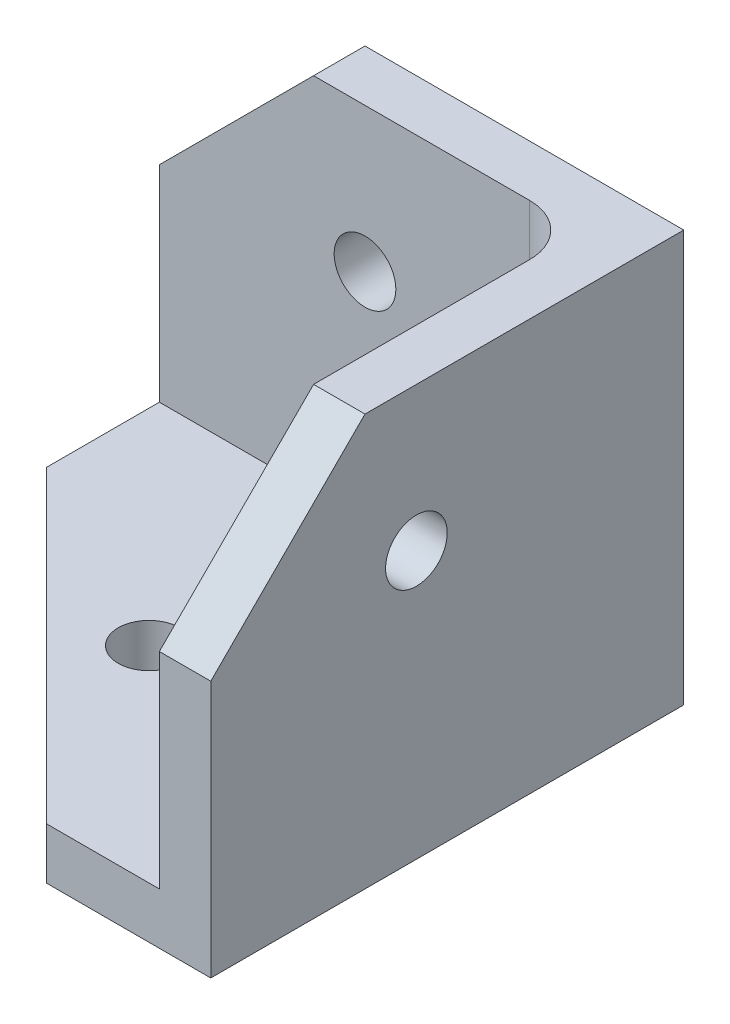
ISO-10303-21;
HEADER;
FILE_DESCRIPTION(('STEP AP214'),'2;1');
FILE_NAME('part.step','',(''),(''),'','','');
FILE_SCHEMA(('AUTOMOTIVE_DESIGN { 1 0 10303 214 1 1 1 1 }'));
ENDSEC;
DATA;
#1=APPLICATION_CONTEXT('core data for automotive mechanical design processes');
#2=APPLICATION_PROTOCOL_DEFINITION('international standard','automotive_design',2000,#1);
#3=PRODUCT_CONTEXT('',#1,'mechanical');
#4=PRODUCT('Part','Part','',(#3));
#5=PRODUCT_RELATED_PRODUCT_CATEGORY('part','',(#4));
#6=PRODUCT_DEFINITION_FORMATION('','',#4);
#7=PRODUCT_DEFINITION_CONTEXT('part definition',#1,'design');
#8=PRODUCT_DEFINITION('design','',#6,#7);
#9=PRODUCT_DEFINITION_SHAPE('','',#8);
#10=(LENGTH_UNIT() NAMED_UNIT(*) SI_UNIT(.MILLI.,.METRE.));
#11=(NAMED_UNIT(*) PLANE_ANGLE_UNIT() SI_UNIT($,.RADIAN.));
#12=(NAMED_UNIT(*) SI_UNIT($,.STERADIAN.) SOLID_ANGLE_UNIT());
#13=UNCERTAINTY_MEASURE_WITH_UNIT(LENGTH_MEASURE(1.E-05),#10,'distance_accuracy_value','');
#14=(GEOMETRIC_REPRESENTATION_CONTEXT(3) GLOBAL_UNCERTAINTY_ASSIGNED_CONTEXT((#13)) GLOBAL_UNIT_ASSIGNED_CONTEXT((#10,
#11,#12)) REPRESENTATION_CONTEXT('',''));
#15=CARTESIAN_POINT('',(0.,0.,0.));
#16=DIRECTION('',(0.,0.,1.));
#17=DIRECTION('',(1.,0.,0.));
#18=AXIS2_PLACEMENT_3D('',#15,#16,#17);
#19=CARTESIAN_POINT('',(-5.,5.,46.));
#20=DIRECTION('',(0.,-1.,0.));
#21=DIRECTION('',(1.,0.,0.));
#22=AXIS2_PLACEMENT_3D('',#19,#20,#21);
#23=PLANE('',#22);
#24=DIRECTION('',(-0.707106781186546,0.,-0.707106781186549));
#25=VECTOR('',#24,1.);
#26=CARTESIAN_POINT('',(-16.,4.99999999999999,46.));
#27=LINE('',#26,#25);
#28=CARTESIAN_POINT('',(-46.,4.99999999999999,15.9999999999999));
#29=VERTEX_POINT('',#28);
#30=CARTESIAN_POINT('',(-16.,5.,46.));
#31=VERTEX_POINT('',#30);
#32=EDGE_CURVE('E136',#29,#31,#27,.F.);
#33=ORIENTED_EDGE('',*,*,#32,.T.);
#34=DIRECTION('',(-1.,0.,0.));
#35=VECTOR('',#34,1.);
#36=CARTESIAN_POINT('',(0.,5.,46.));
#37=LINE('',#36,#35);
#38=CARTESIAN_POINT('',(-5.,5.,46.));
#39=VERTEX_POINT('',#38);
#40=EDGE_CURVE('E146',#31,#39,#37,.F.);
#41=ORIENTED_EDGE('',*,*,#40,.T.);
#42=DIRECTION('',(0.,0.,1.));
#43=VECTOR('',#42,1.);
#44=CARTESIAN_POINT('',(-5.,5.,46.));
#45=LINE('',#44,#43);
#46=CARTESIAN_POINT('',(-5.,5.,9.99999999999999));
#47=VERTEX_POINT('',#46);
#48=EDGE_CURVE('E96',#39,#47,#45,.F.);
#49=ORIENTED_EDGE('',*,*,#48,.T.);
#50=CARTESIAN_POINT('',(-9.99999999999999,5.,9.99999999999999));
#51=DIRECTION('',(0.,-1.,0.));
#52=DIRECTION('',(0.,0.,-1.));
#53=AXIS2_PLACEMENT_3D('',#50,#51,#52);
#54=CIRCLE('',#53,5.);
#55=CARTESIAN_POINT('',(-9.99999999999999,5.,5.));
#56=VERTEX_POINT('',#55);
#57=EDGE_CURVE('E19',#47,#56,#54,.F.);
#58=ORIENTED_EDGE('',*,*,#57,.T.);
#59=DIRECTION('',(1.,0.,0.));
#60=VECTOR('',#59,1.);
#61=CARTESIAN_POINT('',(-46.,5.,5.));
#62=LINE('',#61,#60);
#63=CARTESIAN_POINT('',(-46.,4.99999999999999,5.));
#64=VERTEX_POINT('',#63);
#65=EDGE_CURVE('E102',#64,#56,#62,.T.);
#66=ORIENTED_EDGE('',*,*,#65,.F.);
#67=DIRECTION('',(0.,0.,-1.));
#68=VECTOR('',#67,1.);
#69=CARTESIAN_POINT('',(-46.,4.99999999999999,46.));
#70=LINE('',#69,#68);
#71=EDGE_CURVE('E128',#64,#29,#70,.F.);
#72=ORIENTED_EDGE('',*,*,#71,.T.);
#73=EDGE_LOOP('',(#33,#41,#49,#58,#66,#72));
#74=FACE_BOUND('',#73,.T.);
#75=CARTESIAN_POINT('',(-26.,5.,26.));
#76=DIRECTION('',(0.,1.,0.));
#77=DIRECTION('',(-1.,0.,0.));
#78=AXIS2_PLACEMENT_3D('',#75,#76,#77);
#79=CIRCLE('',#78,3.);
#80=CARTESIAN_POINT('',(-29.,5.,26.));
#81=VERTEX_POINT('',#80);
#82=EDGE_CURVE('E170',#81,#81,#79,.F.);
#83=ORIENTED_EDGE('',*,*,#82,.T.);
#84=EDGE_LOOP('',(#83));
#85=FACE_BOUND('',#84,.T.);
#86=ADVANCED_FACE('F16',(#74,#85),#23,.F.);
#87=CARTESIAN_POINT('',(-5.,40.,46.));
#88=DIRECTION('',(1.,0.,0.));
#89=DIRECTION('',(0.,1.,0.));
#90=AXIS2_PLACEMENT_3D('',#87,#88,#89);
#91=PLANE('',#90);
#92=DIRECTION('',(0.,-1.,0.));
#93=VECTOR('',#92,1.);
#94=CARTESIAN_POINT('',(-5.,40.,9.99999999999999));
#95=LINE('',#94,#93);
#96=CARTESIAN_POINT('',(-5.,40.,9.99999999999999));
#97=VERTEX_POINT('',#96);
#98=EDGE_CURVE('E106',#97,#47,#95,.T.);
#99=ORIENTED_EDGE('',*,*,#98,.T.);
#100=ORIENTED_EDGE('',*,*,#48,.F.);
#101=DIRECTION('',(0.,1.,0.));
#102=VECTOR('',#101,1.);
#103=CARTESIAN_POINT('',(-5.,0.,46.));
#104=LINE('',#103,#102);
#105=CARTESIAN_POINT('',(-5.,25.,46.));
#106=VERTEX_POINT('',#105);
#107=EDGE_CURVE('E133',#39,#106,#104,.T.);
#108=ORIENTED_EDGE('',*,*,#107,.T.);
#109=DIRECTION('',(0.,0.707106781186546,-0.707106781186549));
#110=VECTOR('',#109,1.);
#111=CARTESIAN_POINT('',(-5.,25.,46.));
#112=LINE('',#111,#110);
#113=CARTESIAN_POINT('',(-5.,40.,30.9999999999999));
#114=VERTEX_POINT('',#113);
#115=EDGE_CURVE('E172',#106,#114,#112,.T.);
#116=ORIENTED_EDGE('',*,*,#115,.T.);
#117=DIRECTION('',(0.,0.,-1.));
#118=VECTOR('',#117,1.);
#119=CARTESIAN_POINT('',(-5.,40.,46.));
#120=LINE('',#119,#118);
#121=EDGE_CURVE('E167',#114,#97,#120,.T.);
#122=ORIENTED_EDGE('',*,*,#121,.T.);
#123=EDGE_LOOP('',(#99,#100,#108,#116,#122));
#124=FACE_BOUND('',#123,.T.);
#125=CARTESIAN_POINT('',(-5.,26.,26.));
#126=DIRECTION('',(-1.,0.,0.));
#127=DIRECTION('',(0.,-1.,0.));
#128=AXIS2_PLACEMENT_3D('',#125,#126,#127);
#129=CIRCLE('',#128,3.);
#130=CARTESIAN_POINT('',(-5.,23.,26.));
#131=VERTEX_POINT('',#130);
#132=EDGE_CURVE('E114',#131,#131,#129,.F.);
#133=ORIENTED_EDGE('',*,*,#132,.T.);
#134=EDGE_LOOP('',(#133));
#135=FACE_BOUND('',#134,.T.);
#136=ADVANCED_FACE('F211',(#124,#135),#91,.F.);
#137=CARTESIAN_POINT('',(-10.,40.,9.99999999999999));
#138=DIRECTION('',(0.,-1.,0.));
#139=DIRECTION('',(0.,0.,-1.));
#140=AXIS2_PLACEMENT_3D('',#137,#138,#139);
#141=CYLINDRICAL_SURFACE('',#140,5.);
#142=DIRECTION('',(0.,-1.,0.));
#143=VECTOR('',#142,1.);
#144=CARTESIAN_POINT('',(-9.99999999999999,40.,5.));
#145=LINE('',#144,#143);
#146=CARTESIAN_POINT('',(-10.,40.,5.));
#147=VERTEX_POINT('',#146);
#148=EDGE_CURVE('E108',#56,#147,#145,.F.);
#149=ORIENTED_EDGE('',*,*,#148,.F.);
#150=ORIENTED_EDGE('',*,*,#57,.F.);
#151=ORIENTED_EDGE('',*,*,#98,.F.);
#152=CARTESIAN_POINT('',(-10.,40.,9.99999999999999));
#153=DIRECTION('',(0.,-1.,0.));
#154=DIRECTION('',(0.,0.,-1.));
#155=AXIS2_PLACEMENT_3D('',#152,#153,#154);
#156=CIRCLE('',#155,5.);
#157=EDGE_CURVE('E111',#97,#147,#156,.F.);
#158=ORIENTED_EDGE('',*,*,#157,.T.);
#159=EDGE_LOOP('',(#149,#150,#151,#158));
#160=FACE_BOUND('',#159,.T.);
#161=ADVANCED_FACE('F109',(#160),#141,.F.);
#162=CARTESIAN_POINT('',(-46.,40.,5.));
#163=DIRECTION('',(0.,0.,1.));
#164=DIRECTION('',(0.,-1.,0.));
#165=AXIS2_PLACEMENT_3D('',#162,#163,#164);
#166=PLANE('',#165);
#167=DIRECTION('',(0.707106781186546,0.707106781186549,0.));
#168=VECTOR('',#167,1.);
#169=CARTESIAN_POINT('',(-31.,40.,4.99999999999998));
#170=LINE('',#169,#168);
#171=CARTESIAN_POINT('',(-31.,40.,4.99999999999999));
#172=VERTEX_POINT('',#171);
#173=CARTESIAN_POINT('',(-46.,25.,4.99999999999998));
#174=VERTEX_POINT('',#173);
#175=EDGE_CURVE('E197',#172,#174,#170,.F.);
#176=ORIENTED_EDGE('',*,*,#175,.T.);
#177=DIRECTION('',(0.,1.,0.));
#178=VECTOR('',#177,1.);
#179=CARTESIAN_POINT('',(-46.,4.99999999999999,5.));
#180=LINE('',#179,#178);
#181=EDGE_CURVE('E119',#174,#64,#180,.F.);
#182=ORIENTED_EDGE('',*,*,#181,.T.);
#183=ORIENTED_EDGE('',*,*,#65,.T.);
#184=ORIENTED_EDGE('',*,*,#148,.T.);
#185=DIRECTION('',(1.,0.,0.));
#186=VECTOR('',#185,1.);
#187=CARTESIAN_POINT('',(-5.,40.,5.));
#188=LINE('',#187,#186);
#189=EDGE_CURVE('E166',#147,#172,#188,.F.);
#190=ORIENTED_EDGE('',*,*,#189,.T.);
#191=EDGE_LOOP('',(#176,#182,#183,#184,#190));
#192=FACE_BOUND('',#191,.T.);
#193=CARTESIAN_POINT('',(-26.,26.,5.));
#194=DIRECTION('',(0.,0.,1.));
#195=DIRECTION('',(1.,0.,0.));
#196=AXIS2_PLACEMENT_3D('',#193,#194,#195);
#197=CIRCLE('',#196,3.);
#198=CARTESIAN_POINT('',(-23.,26.,5.));
#199=VERTEX_POINT('',#198);
#200=EDGE_CURVE('E148',#199,#199,#197,.F.);
#201=ORIENTED_EDGE('',*,*,#200,.T.);
#202=EDGE_LOOP('',(#201));
#203=FACE_BOUND('',#202,.T.);
#204=ADVANCED_FACE('F116',(#192,#203),#166,.T.);
#205=CARTESIAN_POINT('',(0.0010000000000036,26.,26.));
#206=DIRECTION('',(-1.,0.,0.));
#207=DIRECTION('',(0.,-1.,0.));
#208=AXIS2_PLACEMENT_3D('',#205,#206,#207);
#209=CYLINDRICAL_SURFACE('',#208,3.);
#210=ORIENTED_EDGE('',*,*,#132,.F.);
#211=EDGE_LOOP('',(#210));
#212=FACE_BOUND('',#211,.T.);
#213=CARTESIAN_POINT('',(0.,26.,26.));
#214=DIRECTION('',(-1.,0.,0.));
#215=DIRECTION('',(0.,-1.,0.));
#216=AXIS2_PLACEMENT_3D('',#213,#214,#215);
#217=CIRCLE('',#216,3.);
#218=CARTESIAN_POINT('',(0.,23.,26.));
#219=VERTEX_POINT('',#218);
#220=EDGE_CURVE('E160',#219,#219,#217,.F.);
#221=ORIENTED_EDGE('',*,*,#220,.T.);
#222=EDGE_LOOP('',(#221));
#223=FACE_BOUND('',#222,.T.);
#224=ADVANCED_FACE('F286',(#212,#223),#209,.F.);
#225=CARTESIAN_POINT('',(0.,25.,46.));
#226=DIRECTION('',(0.,-0.707106781186549,-0.707106781186546));
#227=DIRECTION('',(0.,0.707106781186546,-0.707106781186549));
#228=AXIS2_PLACEMENT_3D('',#225,#226,#227);
#229=PLANE('',#228);
#230=DIRECTION('',(1.,0.,0.));
#231=VECTOR('',#230,1.);
#232=CARTESIAN_POINT('',(-5.,40.,30.9999999999999));
#233=LINE('',#232,#231);
#234=CARTESIAN_POINT('',(0.,40.,30.9999999999999));
#235=VERTEX_POINT('',#234);
#236=EDGE_CURVE('E196',#235,#114,#233,.F.);
#237=ORIENTED_EDGE('',*,*,#236,.T.);
#238=ORIENTED_EDGE('',*,*,#115,.F.);
#239=DIRECTION('',(-1.,0.,0.));
#240=VECTOR('',#239,1.);
#241=CARTESIAN_POINT('',(0.,25.,46.));
#242=LINE('',#241,#240);
#243=CARTESIAN_POINT('',(0.,25.,46.));
#244=VERTEX_POINT('',#243);
#245=EDGE_CURVE('E135',#106,#244,#242,.F.);
#246=ORIENTED_EDGE('',*,*,#245,.T.);
#247=DIRECTION('',(0.,0.707106781186546,-0.707106781186549));
#248=VECTOR('',#247,1.);
#249=CARTESIAN_POINT('',(0.,25.,46.));
#250=LINE('',#249,#248);
#251=EDGE_CURVE('E186',#244,#235,#250,.T.);
#252=ORIENTED_EDGE('',*,*,#251,.T.);
#253=EDGE_LOOP('',(#237,#238,#246,#252));
#254=FACE_BOUND('',#253,.T.);
#255=ADVANCED_FACE('F244',(#254),#229,.F.);
#256=CARTESIAN_POINT('',(-26.,-0.00100000000000881,26.));
#257=DIRECTION('',(0.,1.,0.));
#258=DIRECTION('',(-1.,0.,0.));
#259=AXIS2_PLACEMENT_3D('',#256,#257,#258);
#260=CYLINDRICAL_SURFACE('',#259,3.);
#261=ORIENTED_EDGE('',*,*,#82,.F.);
#262=EDGE_LOOP('',(#261));
#263=FACE_BOUND('',#262,.T.);
#264=CARTESIAN_POINT('',(-26.,0.,26.));
#265=DIRECTION('',(0.,1.,0.));
#266=DIRECTION('',(-1.,0.,0.));
#267=AXIS2_PLACEMENT_3D('',#264,#265,#266);
#268=CIRCLE('',#267,3.);
#269=CARTESIAN_POINT('',(-29.,0.,26.));
#270=VERTEX_POINT('',#269);
#271=EDGE_CURVE('E156',#270,#270,#268,.F.);
#272=ORIENTED_EDGE('',*,*,#271,.T.);
#273=EDGE_LOOP('',(#272));
#274=FACE_BOUND('',#273,.T.);
#275=ADVANCED_FACE('F276',(#263,#274),#260,.F.);
#276=CARTESIAN_POINT('',(-16.,0.,46.));
#277=DIRECTION('',(0.707106781186549,0.,-0.707106781186546));
#278=DIRECTION('',(-0.707106781186546,0.,-0.707106781186549));
#279=AXIS2_PLACEMENT_3D('',#276,#277,#278);
#280=PLANE('',#279);
#281=DIRECTION('',(0.,1.,0.));
#282=VECTOR('',#281,1.);
#283=CARTESIAN_POINT('',(-46.,4.99999999999999,15.9999999999999));
#284=LINE('',#283,#282);
#285=CARTESIAN_POINT('',(-46.,0.,15.9999999999999));
#286=VERTEX_POINT('',#285);
#287=EDGE_CURVE('E130',#29,#286,#284,.F.);
#288=ORIENTED_EDGE('',*,*,#287,.T.);
#289=DIRECTION('',(0.707106781186546,0.,0.707106781186549));
#290=VECTOR('',#289,1.);
#291=CARTESIAN_POINT('',(-46.,0.,15.9999999999999));
#292=LINE('',#291,#290);
#293=CARTESIAN_POINT('',(-16.,0.,46.));
#294=VERTEX_POINT('',#293);
#295=EDGE_CURVE('E236',#286,#294,#292,.T.);
#296=ORIENTED_EDGE('',*,*,#295,.T.);
#297=DIRECTION('',(0.,1.,0.));
#298=VECTOR('',#297,1.);
#299=CARTESIAN_POINT('',(-16.,0.,46.));
#300=LINE('',#299,#298);
#301=EDGE_CURVE('E140',#294,#31,#300,.T.);
#302=ORIENTED_EDGE('',*,*,#301,.T.);
#303=ORIENTED_EDGE('',*,*,#32,.F.);
#304=EDGE_LOOP('',(#288,#296,#302,#303));
#305=FACE_BOUND('',#304,.T.);
#306=ADVANCED_FACE('F234',(#305),#280,.F.);
#307=CARTESIAN_POINT('',(0.,0.,46.));
#308=DIRECTION('',(0.,0.,-1.));
#309=DIRECTION('',(-1.,0.,0.));
#310=AXIS2_PLACEMENT_3D('',#307,#308,#309);
#311=PLANE('',#310);
#312=ORIENTED_EDGE('',*,*,#301,.F.);
#313=DIRECTION('',(-1.,0.,0.));
#314=VECTOR('',#313,1.);
#315=CARTESIAN_POINT('',(0.,0.,46.));
#316=LINE('',#315,#314);
#317=CARTESIAN_POINT('',(0.,0.,46.));
#318=VERTEX_POINT('',#317);
#319=EDGE_CURVE('E155',#294,#318,#316,.F.);
#320=ORIENTED_EDGE('',*,*,#319,.T.);
#321=DIRECTION('',(0.,-1.,0.));
#322=VECTOR('',#321,1.);
#323=CARTESIAN_POINT('',(0.,40.,46.));
#324=LINE('',#323,#322);
#325=EDGE_CURVE('E163',#318,#244,#324,.F.);
#326=ORIENTED_EDGE('',*,*,#325,.T.);
#327=ORIENTED_EDGE('',*,*,#245,.F.);
#328=ORIENTED_EDGE('',*,*,#107,.F.);
#329=ORIENTED_EDGE('',*,*,#40,.F.);
#330=EDGE_LOOP('',(#312,#320,#326,#327,#328,#329));
#331=FACE_BOUND('',#330,.T.);
#332=ADVANCED_FACE('F240',(#331),#311,.F.);
#333=CARTESIAN_POINT('',(-26.,26.,-0.00100000000000013));
#334=DIRECTION('',(0.,0.,1.));
#335=DIRECTION('',(1.,0.,0.));
#336=AXIS2_PLACEMENT_3D('',#333,#334,#335);
#337=CYLINDRICAL_SURFACE('',#336,3.);
#338=ORIENTED_EDGE('',*,*,#200,.F.);
#339=EDGE_LOOP('',(#338));
#340=FACE_BOUND('',#339,.T.);
#341=CARTESIAN_POINT('',(-26.,26.,0.));
#342=DIRECTION('',(0.,0.,1.));
#343=DIRECTION('',(1.,0.,0.));
#344=AXIS2_PLACEMENT_3D('',#341,#342,#343);
#345=CIRCLE('',#344,3.);
#346=CARTESIAN_POINT('',(-23.,26.,0.));
#347=VERTEX_POINT('',#346);
#348=EDGE_CURVE('E151',#347,#347,#345,.T.);
#349=ORIENTED_EDGE('',*,*,#348,.F.);
#350=EDGE_LOOP('',(#349));
#351=FACE_BOUND('',#350,.T.);
#352=ADVANCED_FACE('F304',(#340,#351),#337,.F.);
#353=CARTESIAN_POINT('',(-46.,4.99999999999999,46.));
#354=DIRECTION('',(1.,0.,0.));
#355=DIRECTION('',(0.,0.,-1.));
#356=AXIS2_PLACEMENT_3D('',#353,#354,#355);
#357=PLANE('',#356);
#358=ORIENTED_EDGE('',*,*,#287,.F.);
#359=ORIENTED_EDGE('',*,*,#71,.F.);
#360=ORIENTED_EDGE('',*,*,#181,.F.);
#361=DIRECTION('',(0.,0.,1.));
#362=VECTOR('',#361,1.);
#363=CARTESIAN_POINT('',(-46.,24.9999999999999,46.));
#364=LINE('',#363,#362);
#365=CARTESIAN_POINT('',(-46.,24.9999999999999,0.));
#366=VERTEX_POINT('',#365);
#367=EDGE_CURVE('E195',#174,#366,#364,.F.);
#368=ORIENTED_EDGE('',*,*,#367,.T.);
#369=DIRECTION('',(0.,1.,0.));
#370=VECTOR('',#369,1.);
#371=CARTESIAN_POINT('',(-46.,0.,0.));
#372=LINE('',#371,#370);
#373=CARTESIAN_POINT('',(-46.,0.,0.));
#374=VERTEX_POINT('',#373);
#375=EDGE_CURVE('E154',#374,#366,#372,.T.);
#376=ORIENTED_EDGE('',*,*,#375,.F.);
#377=DIRECTION('',(0.,0.,1.));
#378=VECTOR('',#377,1.);
#379=CARTESIAN_POINT('',(-46.,0.,46.));
#380=LINE('',#379,#378);
#381=EDGE_CURVE('E265',#374,#286,#380,.T.);
#382=ORIENTED_EDGE('',*,*,#381,.T.);
#383=EDGE_LOOP('',(#358,#359,#360,#368,#376,#382));
#384=FACE_BOUND('',#383,.T.);
#385=ADVANCED_FACE('F268',(#384),#357,.F.);
#386=CARTESIAN_POINT('',(-31.,40.,46.));
#387=DIRECTION('',(0.707106781186549,-0.707106781186546,0.));
#388=DIRECTION('',(0.707106781186546,0.707106781186549,0.));
#389=AXIS2_PLACEMENT_3D('',#386,#387,#388);
#390=PLANE('',#389);
#391=ORIENTED_EDGE('',*,*,#367,.F.);
#392=ORIENTED_EDGE('',*,*,#175,.F.);
#393=DIRECTION('',(0.,0.,-1.));
#394=VECTOR('',#393,1.);
#395=CARTESIAN_POINT('',(-31.,40.,46.));
#396=LINE('',#395,#394);
#397=CARTESIAN_POINT('',(-31.,40.,0.));
#398=VERTEX_POINT('',#397);
#399=EDGE_CURVE('E164',#172,#398,#396,.T.);
#400=ORIENTED_EDGE('',*,*,#399,.T.);
#401=DIRECTION('',(0.707106781186546,0.707106781186549,0.));
#402=VECTOR('',#401,1.);
#403=CARTESIAN_POINT('',(-46.,24.9999999999999,0.));
#404=LINE('',#403,#402);
#405=EDGE_CURVE('E258',#366,#398,#404,.T.);
#406=ORIENTED_EDGE('',*,*,#405,.F.);
#407=EDGE_LOOP('',(#391,#392,#400,#406));
#408=FACE_BOUND('',#407,.T.);
#409=ADVANCED_FACE('F298',(#408),#390,.F.);
#410=CARTESIAN_POINT('',(-5.,40.,46.));
#411=DIRECTION('',(0.,-1.,0.));
#412=DIRECTION('',(0.,0.,-1.));
#413=AXIS2_PLACEMENT_3D('',#410,#411,#412);
#414=PLANE('',#413);
#415=ORIENTED_EDGE('',*,*,#399,.F.);
#416=ORIENTED_EDGE('',*,*,#189,.F.);
#417=ORIENTED_EDGE('',*,*,#157,.F.);
#418=ORIENTED_EDGE('',*,*,#121,.F.);
#419=ORIENTED_EDGE('',*,*,#236,.F.);
#420=DIRECTION('',(0.,0.,1.));
#421=VECTOR('',#420,1.);
#422=CARTESIAN_POINT('',(0.,40.,46.));
#423=LINE('',#422,#421);
#424=CARTESIAN_POINT('',(0.,40.,0.));
#425=VERTEX_POINT('',#424);
#426=EDGE_CURVE('E159',#235,#425,#423,.F.);
#427=ORIENTED_EDGE('',*,*,#426,.T.);
#428=DIRECTION('',(-1.,0.,0.));
#429=VECTOR('',#428,1.);
#430=CARTESIAN_POINT('',(0.,40.,0.));
#431=LINE('',#430,#429);
#432=EDGE_CURVE('E252',#398,#425,#431,.F.);
#433=ORIENTED_EDGE('',*,*,#432,.F.);
#434=EDGE_LOOP('',(#415,#416,#417,#418,#419,#427,#433));
#435=FACE_BOUND('',#434,.T.);
#436=ADVANCED_FACE('F215',(#435),#414,.F.);
#437=CARTESIAN_POINT('',(0.,40.,46.));
#438=DIRECTION('',(-1.,0.,0.));
#439=DIRECTION('',(0.,-1.,0.));
#440=AXIS2_PLACEMENT_3D('',#437,#438,#439);
#441=PLANE('',#440);
#442=ORIENTED_EDGE('',*,*,#251,.F.);
#443=ORIENTED_EDGE('',*,*,#325,.F.);
#444=DIRECTION('',(0.,0.,1.));
#445=VECTOR('',#444,1.);
#446=CARTESIAN_POINT('',(0.,0.,46.));
#447=LINE('',#446,#445);
#448=CARTESIAN_POINT('',(0.,0.,0.));
#449=VERTEX_POINT('',#448);
#450=EDGE_CURVE('E34',#318,#449,#447,.F.);
#451=ORIENTED_EDGE('',*,*,#450,.T.);
#452=DIRECTION('',(0.,1.,0.));
#453=VECTOR('',#452,1.);
#454=CARTESIAN_POINT('',(0.,0.,0.));
#455=LINE('',#454,#453);
#456=EDGE_CURVE('E25',#425,#449,#455,.F.);
#457=ORIENTED_EDGE('',*,*,#456,.F.);
#458=ORIENTED_EDGE('',*,*,#426,.F.);
#459=EDGE_LOOP('',(#442,#443,#451,#457,#458));
#460=FACE_BOUND('',#459,.T.);
#461=ORIENTED_EDGE('',*,*,#220,.F.);
#462=EDGE_LOOP('',(#461));
#463=FACE_BOUND('',#462,.T.);
#464=ADVANCED_FACE('F247',(#460,#463),#441,.F.);
#465=CARTESIAN_POINT('',(0.,0.,46.));
#466=DIRECTION('',(0.,1.,0.));
#467=DIRECTION('',(-1.,0.,0.));
#468=AXIS2_PLACEMENT_3D('',#465,#466,#467);
#469=PLANE('',#468);
#470=ORIENTED_EDGE('',*,*,#295,.F.);
#471=ORIENTED_EDGE('',*,*,#381,.F.);
#472=DIRECTION('',(-1.,0.,0.));
#473=VECTOR('',#472,1.);
#474=CARTESIAN_POINT('',(0.,0.,0.));
#475=LINE('',#474,#473);
#476=EDGE_CURVE('E11',#449,#374,#475,.T.);
#477=ORIENTED_EDGE('',*,*,#476,.F.);
#478=ORIENTED_EDGE('',*,*,#450,.F.);
#479=ORIENTED_EDGE('',*,*,#319,.F.);
#480=EDGE_LOOP('',(#470,#471,#477,#478,#479));
#481=FACE_BOUND('',#480,.T.);
#482=ORIENTED_EDGE('',*,*,#271,.F.);
#483=EDGE_LOOP('',(#482));
#484=FACE_BOUND('',#483,.T.);
#485=ADVANCED_FACE('F270',(#481,#484),#469,.F.);
#486=CARTESIAN_POINT('',(0.,0.,0.));
#487=DIRECTION('',(0.,0.,-1.));
#488=DIRECTION('',(-1.,0.,0.));
#489=AXIS2_PLACEMENT_3D('',#486,#487,#488);
#490=PLANE('',#489);
#491=ORIENTED_EDGE('',*,*,#456,.T.);
#492=ORIENTED_EDGE('',*,*,#476,.T.);
#493=ORIENTED_EDGE('',*,*,#375,.T.);
#494=ORIENTED_EDGE('',*,*,#405,.T.);
#495=ORIENTED_EDGE('',*,*,#432,.T.);
#496=EDGE_LOOP('',(#491,#492,#493,#494,#495));
#497=FACE_BOUND('',#496,.T.);
#498=ORIENTED_EDGE('',*,*,#348,.T.);
#499=EDGE_LOOP('',(#498));
#500=FACE_BOUND('',#499,.T.);
#501=ADVANCED_FACE('F255',(#497,#500),#490,.T.);
#502=CLOSED_SHELL('',(#86,#136,#161,#204,#224,#255,#275,#306,#332,#352,#385,#409,#436,#464,#485,#501));
#503=MANIFOLD_SOLID_BREP('B1',#502);
#504=ADVANCED_BREP_SHAPE_REPRESENTATION('',(#18,#503),#14);
#505=SHAPE_DEFINITION_REPRESENTATION(#9,#504);
ENDSEC;
END-ISO-10303-21;
